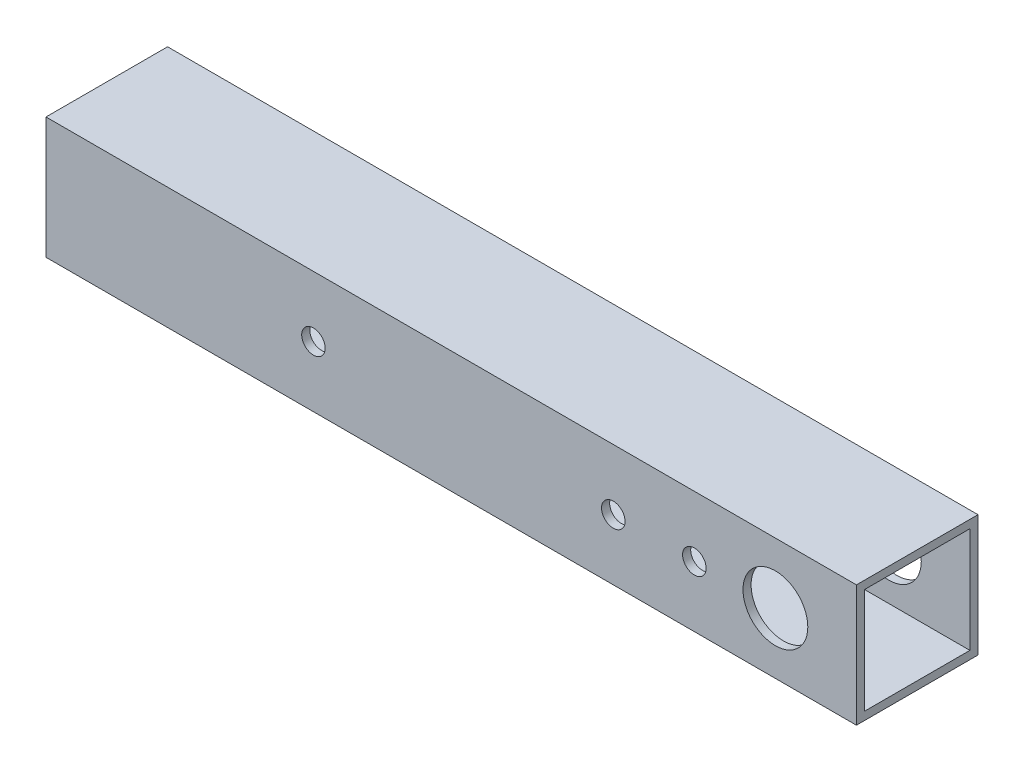
ISO-10303-21;
HEADER;
FILE_DESCRIPTION(('STEP AP214'),'2;1');
FILE_NAME('part.step','',(''),(''),'','','');
FILE_SCHEMA(('AUTOMOTIVE_DESIGN { 1 0 10303 214 1 1 1 1 }'));
ENDSEC;
DATA;
#1=APPLICATION_CONTEXT('core data for automotive mechanical design processes');
#2=APPLICATION_PROTOCOL_DEFINITION('international standard','automotive_design',2000,#1);
#3=PRODUCT_CONTEXT('',#1,'mechanical');
#4=PRODUCT('Part','Part','',(#3));
#5=PRODUCT_RELATED_PRODUCT_CATEGORY('part','',(#4));
#6=PRODUCT_DEFINITION_FORMATION('','',#4);
#7=PRODUCT_DEFINITION_CONTEXT('part definition',#1,'design');
#8=PRODUCT_DEFINITION('design','',#6,#7);
#9=PRODUCT_DEFINITION_SHAPE('','',#8);
#10=(LENGTH_UNIT() NAMED_UNIT(*) SI_UNIT(.MILLI.,.METRE.));
#11=(NAMED_UNIT(*) PLANE_ANGLE_UNIT() SI_UNIT($,.RADIAN.));
#12=(NAMED_UNIT(*) SI_UNIT($,.STERADIAN.) SOLID_ANGLE_UNIT());
#13=UNCERTAINTY_MEASURE_WITH_UNIT(LENGTH_MEASURE(1.E-05),#10,'distance_accuracy_value','');
#14=(GEOMETRIC_REPRESENTATION_CONTEXT(3) GLOBAL_UNCERTAINTY_ASSIGNED_CONTEXT((#13)) GLOBAL_UNIT_ASSIGNED_CONTEXT((#10,
#11,#12)) REPRESENTATION_CONTEXT('',''));
#15=CARTESIAN_POINT('',(0.,0.,0.));
#16=DIRECTION('',(0.,0.,1.));
#17=DIRECTION('',(1.,0.,0.));
#18=AXIS2_PLACEMENT_3D('',#15,#16,#17);
#19=CARTESIAN_POINT('',(100.,6.49999999999999,-6.50000000000001));
#20=DIRECTION('',(0.,-1.,0.));
#21=DIRECTION('',(0.,0.,-1.));
#22=AXIS2_PLACEMENT_3D('',#19,#20,#21);
#23=PLANE('',#22);
#24=DIRECTION('',(0.,0.,1.));
#25=VECTOR('',#24,1.);
#26=CARTESIAN_POINT('',(0.,6.49999999999999,-6.50000000000001));
#27=LINE('',#26,#25);
#28=CARTESIAN_POINT('',(0.,6.49999999999999,-6.50000000000001));
#29=VERTEX_POINT('',#28);
#30=CARTESIAN_POINT('',(0.,6.49999999999999,6.49999999999999));
#31=VERTEX_POINT('',#30);
#32=EDGE_CURVE('E164',#29,#31,#27,.T.);
#33=ORIENTED_EDGE('',*,*,#32,.F.);
#34=DIRECTION('',(-1.,0.,0.));
#35=VECTOR('',#34,1.);
#36=CARTESIAN_POINT('',(100.,6.49999999999999,-6.50000000000001));
#37=LINE('',#36,#35);
#38=CARTESIAN_POINT('',(100.,6.49999999999999,-6.50000000000001));
#39=VERTEX_POINT('',#38);
#40=EDGE_CURVE('E12',#39,#29,#37,.T.);
#41=ORIENTED_EDGE('',*,*,#40,.F.);
#42=DIRECTION('',(0.,0.,1.));
#43=VECTOR('',#42,1.);
#44=CARTESIAN_POINT('',(100.,6.49999999999999,-6.50000000000001));
#45=LINE('',#44,#43);
#46=CARTESIAN_POINT('',(100.,6.49999999999999,6.49999999999999));
#47=VERTEX_POINT('',#46);
#48=EDGE_CURVE('E145',#39,#47,#45,.T.);
#49=ORIENTED_EDGE('',*,*,#48,.T.);
#50=DIRECTION('',(-1.,0.,0.));
#51=VECTOR('',#50,1.);
#52=CARTESIAN_POINT('',(100.,6.49999999999999,6.49999999999999));
#53=LINE('',#52,#51);
#54=EDGE_CURVE('E76',#47,#31,#53,.T.);
#55=ORIENTED_EDGE('',*,*,#54,.T.);
#56=EDGE_LOOP('',(#33,#41,#49,#55));
#57=FACE_BOUND('',#56,.T.);
#58=ADVANCED_FACE('F57',(#57),#23,.T.);
#59=CARTESIAN_POINT('',(100.,-6.50000000000001,-6.50000000000001));
#60=DIRECTION('',(0.,0.,1.));
#61=DIRECTION('',(1.,0.,0.));
#62=AXIS2_PLACEMENT_3D('',#59,#60,#61);
#63=PLANE('',#62);
#64=CARTESIAN_POINT('',(90.,0.,-6.50000000000001));
#65=DIRECTION('',(0.,0.,1.));
#66=DIRECTION('',(1.,0.,0.));
#67=AXIS2_PLACEMENT_3D('',#64,#65,#66);
#68=CIRCLE('',#67,4.00000000000001);
#69=CARTESIAN_POINT('',(94.,0.,-6.50000000000001));
#70=VERTEX_POINT('',#69);
#71=EDGE_CURVE('E209',#70,#70,#68,.T.);
#72=ORIENTED_EDGE('',*,*,#71,.F.);
#73=EDGE_LOOP('',(#72));
#74=FACE_BOUND('',#73,.T.);
#75=CARTESIAN_POINT('',(80.,0.,-6.50000000000001));
#76=DIRECTION('',(0.,0.,1.));
#77=DIRECTION('',(1.,0.,0.));
#78=AXIS2_PLACEMENT_3D('',#75,#76,#77);
#79=CIRCLE('',#78,1.45);
#80=CARTESIAN_POINT('',(81.45,0.,-6.50000000000001));
#81=VERTEX_POINT('',#80);
#82=EDGE_CURVE('E196',#81,#81,#79,.T.);
#83=ORIENTED_EDGE('',*,*,#82,.F.);
#84=EDGE_LOOP('',(#83));
#85=FACE_BOUND('',#84,.T.);
#86=CARTESIAN_POINT('',(70.,0.,-6.50000000000001));
#87=DIRECTION('',(0.,0.,1.));
#88=DIRECTION('',(1.,0.,0.));
#89=AXIS2_PLACEMENT_3D('',#86,#87,#88);
#90=CIRCLE('',#89,1.45);
#91=CARTESIAN_POINT('',(71.45,0.,-6.50000000000001));
#92=VERTEX_POINT('',#91);
#93=EDGE_CURVE('E192',#92,#92,#90,.T.);
#94=ORIENTED_EDGE('',*,*,#93,.F.);
#95=EDGE_LOOP('',(#94));
#96=FACE_BOUND('',#95,.T.);
#97=CARTESIAN_POINT('',(33.,0.,-6.50000000000001));
#98=DIRECTION('',(0.,0.,1.));
#99=DIRECTION('',(1.,0.,0.));
#100=AXIS2_PLACEMENT_3D('',#97,#98,#99);
#101=CIRCLE('',#100,1.45);
#102=CARTESIAN_POINT('',(34.45,0.,-6.50000000000001));
#103=VERTEX_POINT('',#102);
#104=EDGE_CURVE('E158',#103,#103,#101,.T.);
#105=ORIENTED_EDGE('',*,*,#104,.F.);
#106=EDGE_LOOP('',(#105));
#107=FACE_BOUND('',#106,.T.);
#108=DIRECTION('',(0.,1.,0.));
#109=VECTOR('',#108,1.);
#110=CARTESIAN_POINT('',(0.,-6.50000000000001,-6.50000000000001));
#111=LINE('',#110,#109);
#112=CARTESIAN_POINT('',(0.,-6.50000000000001,-6.50000000000001));
#113=VERTEX_POINT('',#112);
#114=EDGE_CURVE('E134',#113,#29,#111,.T.);
#115=ORIENTED_EDGE('',*,*,#114,.F.);
#116=DIRECTION('',(-1.,0.,0.));
#117=VECTOR('',#116,1.);
#118=CARTESIAN_POINT('',(100.,-6.50000000000001,-6.50000000000001));
#119=LINE('',#118,#117);
#120=CARTESIAN_POINT('',(100.,-6.50000000000001,-6.50000000000001));
#121=VERTEX_POINT('',#120);
#122=EDGE_CURVE('E67',#121,#113,#119,.T.);
#123=ORIENTED_EDGE('',*,*,#122,.F.);
#124=DIRECTION('',(0.,1.,0.));
#125=VECTOR('',#124,1.);
#126=CARTESIAN_POINT('',(100.,-6.50000000000001,-6.50000000000001));
#127=LINE('',#126,#125);
#128=EDGE_CURVE('E132',#121,#39,#127,.T.);
#129=ORIENTED_EDGE('',*,*,#128,.T.);
#130=ORIENTED_EDGE('',*,*,#40,.T.);
#131=EDGE_LOOP('',(#115,#123,#129,#130));
#132=FACE_BOUND('',#131,.T.);
#133=ADVANCED_FACE('F131',(#74,#85,#96,#107,#132),#63,.T.);
#134=CARTESIAN_POINT('',(100.,-6.50000000000001,-6.50000000000001));
#135=DIRECTION('',(0.,1.,0.));
#136=DIRECTION('',(0.,0.,1.));
#137=AXIS2_PLACEMENT_3D('',#134,#135,#136);
#138=PLANE('',#137);
#139=DIRECTION('',(0.,0.,-1.));
#140=VECTOR('',#139,1.);
#141=CARTESIAN_POINT('',(0.,-6.50000000000001,-6.50000000000001));
#142=LINE('',#141,#140);
#143=CARTESIAN_POINT('',(0.,-6.50000000000001,6.49999999999999));
#144=VERTEX_POINT('',#143);
#145=EDGE_CURVE('E167',#144,#113,#142,.T.);
#146=ORIENTED_EDGE('',*,*,#145,.F.);
#147=DIRECTION('',(-1.,0.,0.));
#148=VECTOR('',#147,1.);
#149=CARTESIAN_POINT('',(100.,-6.50000000000001,6.49999999999999));
#150=LINE('',#149,#148);
#151=CARTESIAN_POINT('',(100.,-6.50000000000001,6.49999999999999));
#152=VERTEX_POINT('',#151);
#153=EDGE_CURVE('E101',#152,#144,#150,.T.);
#154=ORIENTED_EDGE('',*,*,#153,.F.);
#155=DIRECTION('',(0.,0.,-1.));
#156=VECTOR('',#155,1.);
#157=CARTESIAN_POINT('',(100.,-6.50000000000001,-6.50000000000001));
#158=LINE('',#157,#156);
#159=EDGE_CURVE('E144',#152,#121,#158,.T.);
#160=ORIENTED_EDGE('',*,*,#159,.T.);
#161=ORIENTED_EDGE('',*,*,#122,.T.);
#162=EDGE_LOOP('',(#146,#154,#160,#161));
#163=FACE_BOUND('',#162,.T.);
#164=ADVANCED_FACE('F147',(#163),#138,.T.);
#165=CARTESIAN_POINT('',(100.,7.49999999999999,-7.50000000000001));
#166=DIRECTION('',(0.,-1.,0.));
#167=DIRECTION('',(0.,0.,-1.));
#168=AXIS2_PLACEMENT_3D('',#165,#166,#167);
#169=PLANE('',#168);
#170=DIRECTION('',(0.,0.,1.));
#171=VECTOR('',#170,1.);
#172=CARTESIAN_POINT('',(0.,7.49999999999999,-7.50000000000001));
#173=LINE('',#172,#171);
#174=CARTESIAN_POINT('',(0.,7.49999999999999,-7.50000000000001));
#175=VERTEX_POINT('',#174);
#176=CARTESIAN_POINT('',(0.,7.49999999999999,7.49999999999999));
#177=VERTEX_POINT('',#176);
#178=EDGE_CURVE('E154',#175,#177,#173,.T.);
#179=ORIENTED_EDGE('',*,*,#178,.T.);
#180=DIRECTION('',(-1.,0.,0.));
#181=VECTOR('',#180,1.);
#182=CARTESIAN_POINT('',(100.,7.49999999999999,7.49999999999999));
#183=LINE('',#182,#181);
#184=CARTESIAN_POINT('',(100.,7.49999999999999,7.49999999999999));
#185=VERTEX_POINT('',#184);
#186=EDGE_CURVE('E174',#185,#177,#183,.T.);
#187=ORIENTED_EDGE('',*,*,#186,.F.);
#188=DIRECTION('',(0.,0.,1.));
#189=VECTOR('',#188,1.);
#190=CARTESIAN_POINT('',(100.,7.49999999999999,-7.50000000000001));
#191=LINE('',#190,#189);
#192=CARTESIAN_POINT('',(100.,7.49999999999999,-7.50000000000001));
#193=VERTEX_POINT('',#192);
#194=EDGE_CURVE('E172',#193,#185,#191,.T.);
#195=ORIENTED_EDGE('',*,*,#194,.F.);
#196=DIRECTION('',(-1.,0.,0.));
#197=VECTOR('',#196,1.);
#198=CARTESIAN_POINT('',(100.,7.49999999999999,-7.50000000000001));
#199=LINE('',#198,#197);
#200=EDGE_CURVE('E150',#193,#175,#199,.T.);
#201=ORIENTED_EDGE('',*,*,#200,.T.);
#202=EDGE_LOOP('',(#179,#187,#195,#201));
#203=FACE_BOUND('',#202,.T.);
#204=ADVANCED_FACE('F59',(#203),#169,.F.);
#205=CARTESIAN_POINT('',(100.,-7.50000000000001,7.49999999999999));
#206=DIRECTION('',(0.,0.,-1.));
#207=DIRECTION('',(-1.,0.,0.));
#208=AXIS2_PLACEMENT_3D('',#205,#206,#207);
#209=PLANE('',#208);
#210=CARTESIAN_POINT('',(90.,0.,7.49999999999999));
#211=DIRECTION('',(0.,0.,1.));
#212=DIRECTION('',(1.,0.,0.));
#213=AXIS2_PLACEMENT_3D('',#210,#211,#212);
#214=CIRCLE('',#213,4.00000000000001);
#215=CARTESIAN_POINT('',(94.,0.,7.49999999999999));
#216=VERTEX_POINT('',#215);
#217=EDGE_CURVE('E264',#216,#216,#214,.T.);
#218=ORIENTED_EDGE('',*,*,#217,.F.);
#219=EDGE_LOOP('',(#218));
#220=FACE_BOUND('',#219,.T.);
#221=CARTESIAN_POINT('',(80.,0.,7.49999999999999));
#222=DIRECTION('',(0.,0.,1.));
#223=DIRECTION('',(1.,0.,0.));
#224=AXIS2_PLACEMENT_3D('',#221,#222,#223);
#225=CIRCLE('',#224,1.45);
#226=CARTESIAN_POINT('',(81.45,0.,7.49999999999999));
#227=VERTEX_POINT('',#226);
#228=EDGE_CURVE('E268',#227,#227,#225,.T.);
#229=ORIENTED_EDGE('',*,*,#228,.F.);
#230=EDGE_LOOP('',(#229));
#231=FACE_BOUND('',#230,.T.);
#232=CARTESIAN_POINT('',(70.,0.,7.49999999999999));
#233=DIRECTION('',(0.,0.,1.));
#234=DIRECTION('',(1.,0.,0.));
#235=AXIS2_PLACEMENT_3D('',#232,#233,#234);
#236=CIRCLE('',#235,1.45);
#237=CARTESIAN_POINT('',(71.45,0.,7.49999999999999));
#238=VERTEX_POINT('',#237);
#239=EDGE_CURVE('E272',#238,#238,#236,.T.);
#240=ORIENTED_EDGE('',*,*,#239,.F.);
#241=EDGE_LOOP('',(#240));
#242=FACE_BOUND('',#241,.T.);
#243=CARTESIAN_POINT('',(33.,0.,7.49999999999999));
#244=DIRECTION('',(0.,0.,1.));
#245=DIRECTION('',(1.,0.,0.));
#246=AXIS2_PLACEMENT_3D('',#243,#244,#245);
#247=CIRCLE('',#246,1.45);
#248=CARTESIAN_POINT('',(34.45,0.,7.49999999999999));
#249=VERTEX_POINT('',#248);
#250=EDGE_CURVE('E189',#249,#249,#247,.T.);
#251=ORIENTED_EDGE('',*,*,#250,.F.);
#252=EDGE_LOOP('',(#251));
#253=FACE_BOUND('',#252,.T.);
#254=DIRECTION('',(0.,-1.,0.));
#255=VECTOR('',#254,1.);
#256=CARTESIAN_POINT('',(0.,-7.50000000000001,7.49999999999999));
#257=LINE('',#256,#255);
#258=CARTESIAN_POINT('',(0.,-7.50000000000001,7.49999999999999));
#259=VERTEX_POINT('',#258);
#260=EDGE_CURVE('E157',#177,#259,#257,.T.);
#261=ORIENTED_EDGE('',*,*,#260,.T.);
#262=DIRECTION('',(-1.,0.,0.));
#263=VECTOR('',#262,1.);
#264=CARTESIAN_POINT('',(100.,-7.50000000000001,7.49999999999999));
#265=LINE('',#264,#263);
#266=CARTESIAN_POINT('',(100.,-7.50000000000001,7.49999999999999));
#267=VERTEX_POINT('',#266);
#268=EDGE_CURVE('E181',#267,#259,#265,.T.);
#269=ORIENTED_EDGE('',*,*,#268,.F.);
#270=DIRECTION('',(0.,-1.,0.));
#271=VECTOR('',#270,1.);
#272=CARTESIAN_POINT('',(100.,-7.50000000000001,7.49999999999999));
#273=LINE('',#272,#271);
#274=EDGE_CURVE('E114',#185,#267,#273,.T.);
#275=ORIENTED_EDGE('',*,*,#274,.F.);
#276=ORIENTED_EDGE('',*,*,#186,.T.);
#277=EDGE_LOOP('',(#261,#269,#275,#276));
#278=FACE_BOUND('',#277,.T.);
#279=ADVANCED_FACE('F253',(#220,#231,#242,#253,#278),#209,.F.);
#280=CARTESIAN_POINT('',(100.,-7.49999999999999,-7.50000000000001));
#281=DIRECTION('',(0.,1.,0.));
#282=DIRECTION('',(0.,0.,1.));
#283=AXIS2_PLACEMENT_3D('',#280,#281,#282);
#284=PLANE('',#283);
#285=DIRECTION('',(0.,0.,-1.));
#286=VECTOR('',#285,1.);
#287=CARTESIAN_POINT('',(0.,-7.49999999999999,-7.50000000000001));
#288=LINE('',#287,#286);
#289=CARTESIAN_POINT('',(0.,-7.49999999999999,-7.50000000000001));
#290=VERTEX_POINT('',#289);
#291=EDGE_CURVE('E160',#259,#290,#288,.T.);
#292=ORIENTED_EDGE('',*,*,#291,.T.);
#293=DIRECTION('',(-1.,0.,0.));
#294=VECTOR('',#293,1.);
#295=CARTESIAN_POINT('',(100.,-7.49999999999999,-7.50000000000001));
#296=LINE('',#295,#294);
#297=CARTESIAN_POINT('',(100.,-7.49999999999999,-7.50000000000001));
#298=VERTEX_POINT('',#297);
#299=EDGE_CURVE('E178',#298,#290,#296,.T.);
#300=ORIENTED_EDGE('',*,*,#299,.F.);
#301=DIRECTION('',(0.,0.,-1.));
#302=VECTOR('',#301,1.);
#303=CARTESIAN_POINT('',(100.,-7.49999999999999,-7.50000000000001));
#304=LINE('',#303,#302);
#305=EDGE_CURVE('E220',#267,#298,#304,.T.);
#306=ORIENTED_EDGE('',*,*,#305,.F.);
#307=ORIENTED_EDGE('',*,*,#268,.T.);
#308=EDGE_LOOP('',(#292,#300,#306,#307));
#309=FACE_BOUND('',#308,.T.);
#310=ADVANCED_FACE('F236',(#309),#284,.F.);
#311=CARTESIAN_POINT('',(100.,-7.49999999999999,-7.50000000000001));
#312=DIRECTION('',(0.,0.,1.));
#313=DIRECTION('',(1.,0.,0.));
#314=AXIS2_PLACEMENT_3D('',#311,#312,#313);
#315=PLANE('',#314);
#316=CARTESIAN_POINT('',(90.,0.,-7.50000000000001));
#317=DIRECTION('',(0.,0.,1.));
#318=DIRECTION('',(1.,0.,0.));
#319=AXIS2_PLACEMENT_3D('',#316,#317,#318);
#320=CIRCLE('',#319,4.00000000000001);
#321=CARTESIAN_POINT('',(94.,0.,-7.50000000000001));
#322=VERTEX_POINT('',#321);
#323=EDGE_CURVE('E193',#322,#322,#320,.T.);
#324=ORIENTED_EDGE('',*,*,#323,.T.);
#325=EDGE_LOOP('',(#324));
#326=FACE_BOUND('',#325,.T.);
#327=CARTESIAN_POINT('',(80.,0.,-7.50000000000001));
#328=DIRECTION('',(0.,0.,1.));
#329=DIRECTION('',(1.,0.,0.));
#330=AXIS2_PLACEMENT_3D('',#327,#328,#329);
#331=CIRCLE('',#330,1.45);
#332=CARTESIAN_POINT('',(81.45,0.,-7.50000000000001));
#333=VERTEX_POINT('',#332);
#334=EDGE_CURVE('E326',#333,#333,#331,.T.);
#335=ORIENTED_EDGE('',*,*,#334,.T.);
#336=EDGE_LOOP('',(#335));
#337=FACE_BOUND('',#336,.T.);
#338=CARTESIAN_POINT('',(70.,0.,-7.50000000000001));
#339=DIRECTION('',(0.,0.,1.));
#340=DIRECTION('',(1.,0.,0.));
#341=AXIS2_PLACEMENT_3D('',#338,#339,#340);
#342=CIRCLE('',#341,1.45);
#343=CARTESIAN_POINT('',(71.45,0.,-7.50000000000001));
#344=VERTEX_POINT('',#343);
#345=EDGE_CURVE('E206',#344,#344,#342,.T.);
#346=ORIENTED_EDGE('',*,*,#345,.T.);
#347=EDGE_LOOP('',(#346));
#348=FACE_BOUND('',#347,.T.);
#349=CARTESIAN_POINT('',(33.,0.,-7.50000000000001));
#350=DIRECTION('',(0.,0.,1.));
#351=DIRECTION('',(1.,0.,0.));
#352=AXIS2_PLACEMENT_3D('',#349,#350,#351);
#353=CIRCLE('',#352,1.45);
#354=CARTESIAN_POINT('',(34.45,0.,-7.50000000000001));
#355=VERTEX_POINT('',#354);
#356=EDGE_CURVE('E188',#355,#355,#353,.T.);
#357=ORIENTED_EDGE('',*,*,#356,.T.);
#358=EDGE_LOOP('',(#357));
#359=FACE_BOUND('',#358,.T.);
#360=DIRECTION('',(0.,1.,0.));
#361=VECTOR('',#360,1.);
#362=CARTESIAN_POINT('',(0.,-7.49999999999999,-7.50000000000001));
#363=LINE('',#362,#361);
#364=EDGE_CURVE('E162',#290,#175,#363,.T.);
#365=ORIENTED_EDGE('',*,*,#364,.T.);
#366=ORIENTED_EDGE('',*,*,#200,.F.);
#367=DIRECTION('',(0.,1.,0.));
#368=VECTOR('',#367,1.);
#369=CARTESIAN_POINT('',(100.,-7.49999999999999,-7.50000000000001));
#370=LINE('',#369,#368);
#371=EDGE_CURVE('E222',#298,#193,#370,.T.);
#372=ORIENTED_EDGE('',*,*,#371,.F.);
#373=ORIENTED_EDGE('',*,*,#299,.T.);
#374=EDGE_LOOP('',(#365,#366,#372,#373));
#375=FACE_BOUND('',#374,.T.);
#376=ADVANCED_FACE('F225',(#326,#337,#348,#359,#375),#315,.F.);
#377=CARTESIAN_POINT('',(100.,-6.50000000000001,6.49999999999999));
#378=DIRECTION('',(0.,0.,-1.));
#379=DIRECTION('',(-1.,0.,0.));
#380=AXIS2_PLACEMENT_3D('',#377,#378,#379);
#381=PLANE('',#380);
#382=CARTESIAN_POINT('',(90.,0.,6.49999999999999));
#383=DIRECTION('',(0.,0.,-1.));
#384=DIRECTION('',(-1.,0.,0.));
#385=AXIS2_PLACEMENT_3D('',#382,#383,#384);
#386=CIRCLE('',#385,4.00000000000001);
#387=CARTESIAN_POINT('',(86.,0.,6.49999999999999));
#388=VERTEX_POINT('',#387);
#389=EDGE_CURVE('E61',#388,#388,#386,.T.);
#390=ORIENTED_EDGE('',*,*,#389,.F.);
#391=EDGE_LOOP('',(#390));
#392=FACE_BOUND('',#391,.T.);
#393=CARTESIAN_POINT('',(80.,0.,6.49999999999999));
#394=DIRECTION('',(0.,0.,-1.));
#395=DIRECTION('',(-1.,0.,0.));
#396=AXIS2_PLACEMENT_3D('',#393,#394,#395);
#397=CIRCLE('',#396,1.45);
#398=CARTESIAN_POINT('',(78.55,0.,6.49999999999999));
#399=VERTEX_POINT('',#398);
#400=EDGE_CURVE('E194',#399,#399,#397,.T.);
#401=ORIENTED_EDGE('',*,*,#400,.F.);
#402=EDGE_LOOP('',(#401));
#403=FACE_BOUND('',#402,.T.);
#404=CARTESIAN_POINT('',(70.,0.,6.49999999999999));
#405=DIRECTION('',(0.,0.,-1.));
#406=DIRECTION('',(-1.,0.,0.));
#407=AXIS2_PLACEMENT_3D('',#404,#405,#406);
#408=CIRCLE('',#407,1.45);
#409=CARTESIAN_POINT('',(68.55,0.,6.49999999999999));
#410=VERTEX_POINT('',#409);
#411=EDGE_CURVE('E190',#410,#410,#408,.T.);
#412=ORIENTED_EDGE('',*,*,#411,.F.);
#413=EDGE_LOOP('',(#412));
#414=FACE_BOUND('',#413,.T.);
#415=CARTESIAN_POINT('',(33.,0.,6.49999999999998));
#416=DIRECTION('',(0.,0.,-1.));
#417=DIRECTION('',(-1.,0.,0.));
#418=AXIS2_PLACEMENT_3D('',#415,#416,#417);
#419=CIRCLE('',#418,1.45);
#420=CARTESIAN_POINT('',(31.55,0.,6.49999999999998));
#421=VERTEX_POINT('',#420);
#422=EDGE_CURVE('E185',#421,#421,#419,.T.);
#423=ORIENTED_EDGE('',*,*,#422,.F.);
#424=EDGE_LOOP('',(#423));
#425=FACE_BOUND('',#424,.T.);
#426=DIRECTION('',(0.,-1.,0.));
#427=VECTOR('',#426,1.);
#428=CARTESIAN_POINT('',(0.,-6.50000000000001,6.49999999999999));
#429=LINE('',#428,#427);
#430=EDGE_CURVE('E169',#31,#144,#429,.T.);
#431=ORIENTED_EDGE('',*,*,#430,.F.);
#432=ORIENTED_EDGE('',*,*,#54,.F.);
#433=DIRECTION('',(0.,-1.,0.));
#434=VECTOR('',#433,1.);
#435=CARTESIAN_POINT('',(100.,-6.50000000000001,6.49999999999999));
#436=LINE('',#435,#434);
#437=EDGE_CURVE('E148',#47,#152,#436,.T.);
#438=ORIENTED_EDGE('',*,*,#437,.T.);
#439=ORIENTED_EDGE('',*,*,#153,.T.);
#440=EDGE_LOOP('',(#431,#432,#438,#439));
#441=FACE_BOUND('',#440,.T.);
#442=ADVANCED_FACE('F223',(#392,#403,#414,#425,#441),#381,.T.);
#443=CARTESIAN_POINT('',(100.,0.,0.));
#444=DIRECTION('',(-1.,0.,0.));
#445=DIRECTION('',(0.,0.,1.));
#446=AXIS2_PLACEMENT_3D('',#443,#444,#445);
#447=PLANE('',#446);
#448=ORIENTED_EDGE('',*,*,#194,.T.);
#449=ORIENTED_EDGE('',*,*,#274,.T.);
#450=ORIENTED_EDGE('',*,*,#305,.T.);
#451=ORIENTED_EDGE('',*,*,#371,.T.);
#452=EDGE_LOOP('',(#448,#449,#450,#451));
#453=FACE_BOUND('',#452,.T.);
#454=ORIENTED_EDGE('',*,*,#48,.F.);
#455=ORIENTED_EDGE('',*,*,#128,.F.);
#456=ORIENTED_EDGE('',*,*,#159,.F.);
#457=ORIENTED_EDGE('',*,*,#437,.F.);
#458=EDGE_LOOP('',(#454,#455,#456,#457));
#459=FACE_BOUND('',#458,.T.);
#460=ADVANCED_FACE('F142',(#453,#459),#447,.F.);
#461=CARTESIAN_POINT('',(0.,0.,0.));
#462=DIRECTION('',(-1.,0.,0.));
#463=DIRECTION('',(0.,0.,1.));
#464=AXIS2_PLACEMENT_3D('',#461,#462,#463);
#465=PLANE('',#464);
#466=ORIENTED_EDGE('',*,*,#178,.F.);
#467=ORIENTED_EDGE('',*,*,#364,.F.);
#468=ORIENTED_EDGE('',*,*,#291,.F.);
#469=ORIENTED_EDGE('',*,*,#260,.F.);
#470=EDGE_LOOP('',(#466,#467,#468,#469));
#471=FACE_BOUND('',#470,.T.);
#472=ORIENTED_EDGE('',*,*,#32,.T.);
#473=ORIENTED_EDGE('',*,*,#430,.T.);
#474=ORIENTED_EDGE('',*,*,#145,.T.);
#475=ORIENTED_EDGE('',*,*,#114,.T.);
#476=EDGE_LOOP('',(#472,#473,#474,#475));
#477=FACE_BOUND('',#476,.T.);
#478=ADVANCED_FACE('F233',(#471,#477),#465,.T.);
#479=CARTESIAN_POINT('',(33.,0.,-14.5));
#480=DIRECTION('',(0.,0.,1.));
#481=DIRECTION('',(1.,0.,0.));
#482=AXIS2_PLACEMENT_3D('',#479,#480,#481);
#483=CYLINDRICAL_SURFACE('',#482,1.45);
#484=ORIENTED_EDGE('',*,*,#422,.T.);
#485=EDGE_LOOP('',(#484));
#486=FACE_BOUND('',#485,.T.);
#487=ORIENTED_EDGE('',*,*,#250,.T.);
#488=EDGE_LOOP('',(#487));
#489=FACE_BOUND('',#488,.T.);
#490=ADVANCED_FACE('F287',(#486,#489),#483,.F.);
#491=ORIENTED_EDGE('',*,*,#104,.T.);
#492=EDGE_LOOP('',(#491));
#493=FACE_BOUND('',#492,.T.);
#494=ORIENTED_EDGE('',*,*,#356,.F.);
#495=EDGE_LOOP('',(#494));
#496=FACE_BOUND('',#495,.T.);
#497=ADVANCED_FACE('F291',(#493,#496),#483,.F.);
#498=CARTESIAN_POINT('',(70.,0.,-7.50000000000001));
#499=DIRECTION('',(0.,0.,1.));
#500=DIRECTION('',(1.,0.,0.));
#501=AXIS2_PLACEMENT_3D('',#498,#499,#500);
#502=CYLINDRICAL_SURFACE('',#501,1.45);
#503=ORIENTED_EDGE('',*,*,#411,.T.);
#504=EDGE_LOOP('',(#503));
#505=FACE_BOUND('',#504,.T.);
#506=ORIENTED_EDGE('',*,*,#239,.T.);
#507=EDGE_LOOP('',(#506));
#508=FACE_BOUND('',#507,.T.);
#509=ADVANCED_FACE('F295',(#505,#508),#502,.F.);
#510=CARTESIAN_POINT('',(80.,0.,-7.50000000000001));
#511=DIRECTION('',(0.,0.,1.));
#512=DIRECTION('',(1.,0.,0.));
#513=AXIS2_PLACEMENT_3D('',#510,#511,#512);
#514=CYLINDRICAL_SURFACE('',#513,1.45);
#515=ORIENTED_EDGE('',*,*,#400,.T.);
#516=EDGE_LOOP('',(#515));
#517=FACE_BOUND('',#516,.T.);
#518=ORIENTED_EDGE('',*,*,#228,.T.);
#519=EDGE_LOOP('',(#518));
#520=FACE_BOUND('',#519,.T.);
#521=ADVANCED_FACE('F297',(#517,#520),#514,.F.);
#522=CARTESIAN_POINT('',(90.,0.,-7.50000000000001));
#523=DIRECTION('',(0.,0.,1.));
#524=DIRECTION('',(1.,0.,0.));
#525=AXIS2_PLACEMENT_3D('',#522,#523,#524);
#526=CYLINDRICAL_SURFACE('',#525,4.00000000000001);
#527=ORIENTED_EDGE('',*,*,#389,.T.);
#528=EDGE_LOOP('',(#527));
#529=FACE_BOUND('',#528,.T.);
#530=ORIENTED_EDGE('',*,*,#217,.T.);
#531=EDGE_LOOP('',(#530));
#532=FACE_BOUND('',#531,.T.);
#533=ADVANCED_FACE('F302',(#529,#532),#526,.F.);
#534=ORIENTED_EDGE('',*,*,#93,.T.);
#535=EDGE_LOOP('',(#534));
#536=FACE_BOUND('',#535,.T.);
#537=ORIENTED_EDGE('',*,*,#345,.F.);
#538=EDGE_LOOP('',(#537));
#539=FACE_BOUND('',#538,.T.);
#540=ADVANCED_FACE('F299',(#536,#539),#502,.F.);
#541=ORIENTED_EDGE('',*,*,#82,.T.);
#542=EDGE_LOOP('',(#541));
#543=FACE_BOUND('',#542,.T.);
#544=ORIENTED_EDGE('',*,*,#334,.F.);
#545=EDGE_LOOP('',(#544));
#546=FACE_BOUND('',#545,.T.);
#547=ADVANCED_FACE('F303',(#543,#546),#514,.F.);
#548=ORIENTED_EDGE('',*,*,#71,.T.);
#549=EDGE_LOOP('',(#548));
#550=FACE_BOUND('',#549,.T.);
#551=ORIENTED_EDGE('',*,*,#323,.F.);
#552=EDGE_LOOP('',(#551));
#553=FACE_BOUND('',#552,.T.);
#554=ADVANCED_FACE('F306',(#550,#553),#526,.F.);
#555=CLOSED_SHELL('',(#58,#133,#164,#204,#279,#310,#376,#442,#460,#478,#490,#497,#509,#521,#533,
#540,#547,#554));
#556=MANIFOLD_SOLID_BREP('B2',#555);
#557=ADVANCED_BREP_SHAPE_REPRESENTATION('',(#18,#556),#14);
#558=SHAPE_DEFINITION_REPRESENTATION(#9,#557);
ENDSEC;
END-ISO-10303-21;
